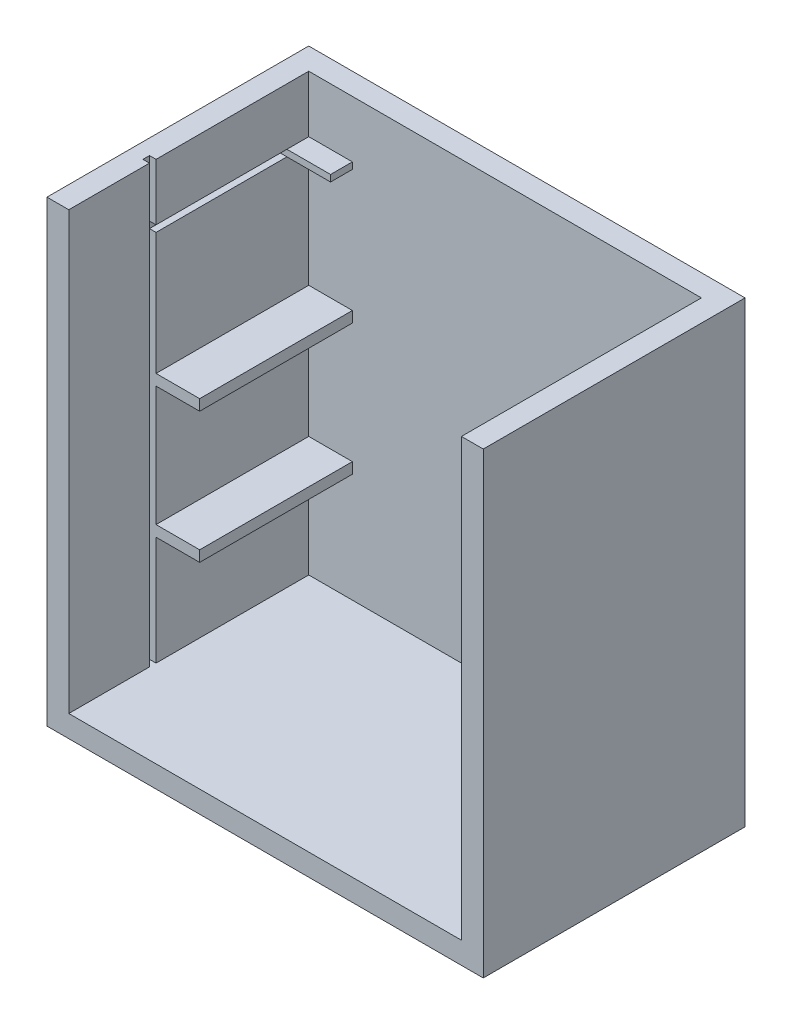
ISO-10303-21;
HEADER;
FILE_DESCRIPTION(('STEP AP214'),'2;1');
FILE_NAME('part.step','',(''),(''),'','','');
FILE_SCHEMA(('AUTOMOTIVE_DESIGN { 1 0 10303 214 1 1 1 1 }'));
ENDSEC;
DATA;
#1=APPLICATION_CONTEXT('core data for automotive mechanical design processes');
#2=APPLICATION_PROTOCOL_DEFINITION('international standard','automotive_design',2000,#1);
#3=PRODUCT_CONTEXT('',#1,'mechanical');
#4=PRODUCT('Part','Part','',(#3));
#5=PRODUCT_RELATED_PRODUCT_CATEGORY('part','',(#4));
#6=PRODUCT_DEFINITION_FORMATION('','',#4);
#7=PRODUCT_DEFINITION_CONTEXT('part definition',#1,'design');
#8=PRODUCT_DEFINITION('design','',#6,#7);
#9=PRODUCT_DEFINITION_SHAPE('','',#8);
#10=(LENGTH_UNIT() NAMED_UNIT(*) SI_UNIT(.MILLI.,.METRE.));
#11=(NAMED_UNIT(*) PLANE_ANGLE_UNIT() SI_UNIT($,.RADIAN.));
#12=(NAMED_UNIT(*) SI_UNIT($,.STERADIAN.) SOLID_ANGLE_UNIT());
#13=UNCERTAINTY_MEASURE_WITH_UNIT(LENGTH_MEASURE(1.E-05),#10,'distance_accuracy_value','');
#14=(GEOMETRIC_REPRESENTATION_CONTEXT(3) GLOBAL_UNCERTAINTY_ASSIGNED_CONTEXT((#13)) GLOBAL_UNIT_ASSIGNED_CONTEXT((#10,
#11,#12)) REPRESENTATION_CONTEXT('',''));
#15=CARTESIAN_POINT('',(0.,0.,0.));
#16=DIRECTION('',(0.,0.,1.));
#17=DIRECTION('',(1.,0.,0.));
#18=AXIS2_PLACEMENT_3D('',#15,#16,#17);
#19=CARTESIAN_POINT('',(30.,1.11022302462517E-13,-40.0000000000005));
#20=DIRECTION('',(0.,0.,1.));
#21=DIRECTION('',(0.,-1.,0.));
#22=AXIS2_PLACEMENT_3D('',#19,#20,#21);
#23=PLANE('',#22);
#24=DIRECTION('',(-1.,0.,0.));
#25=VECTOR('',#24,1.);
#26=CARTESIAN_POINT('',(0.,184.,-40.0000000000005));
#27=LINE('',#26,#25);
#28=CARTESIAN_POINT('',(10.,184.,-40.0000000000005));
#29=VERTEX_POINT('',#28);
#30=CARTESIAN_POINT('',(7.,184.,-40.));
#31=VERTEX_POINT('',#30);
#32=EDGE_CURVE('E396',#29,#31,#27,.T.);
#33=ORIENTED_EDGE('',*,*,#32,.F.);
#34=DIRECTION('',(0.,1.,0.));
#35=VECTOR('',#34,1.);
#36=CARTESIAN_POINT('',(10.,185.,-40.));
#37=LINE('',#36,#35);
#38=CARTESIAN_POINT('',(10.,210.,-40.));
#39=VERTEX_POINT('',#38);
#40=EDGE_CURVE('E354',#29,#39,#37,.T.);
#41=ORIENTED_EDGE('',*,*,#40,.T.);
#42=DIRECTION('',(1.,0.,0.));
#43=VECTOR('',#42,1.);
#44=CARTESIAN_POINT('',(7.,210.,-40.));
#45=LINE('',#44,#43);
#46=CARTESIAN_POINT('',(7.,210.,-40.));
#47=VERTEX_POINT('',#46);
#48=EDGE_CURVE('E372',#47,#39,#45,.T.);
#49=ORIENTED_EDGE('',*,*,#48,.F.);
#50=DIRECTION('',(0.,1.,0.));
#51=VECTOR('',#50,1.);
#52=CARTESIAN_POINT('',(7.,10.,-40.));
#53=LINE('',#52,#51);
#54=EDGE_CURVE('E360',#31,#47,#53,.T.);
#55=ORIENTED_EDGE('',*,*,#54,.F.);
#56=EDGE_LOOP('',(#33,#41,#49,#55));
#57=FACE_BOUND('',#56,.T.);
#58=ADVANCED_FACE('F41',(#57),#23,.T.);
#59=CARTESIAN_POINT('',(10.,210.,0.));
#60=DIRECTION('',(-1.,0.,0.));
#61=DIRECTION('',(0.,0.,1.));
#62=AXIS2_PLACEMENT_3D('',#59,#60,#61);
#63=PLANE('',#62);
#64=DIRECTION('',(0.,0.,-1.));
#65=VECTOR('',#64,1.);
#66=CARTESIAN_POINT('',(10.,10.,0.));
#67=LINE('',#66,#65);
#68=CARTESIAN_POINT('',(10.,10.,0.));
#69=VERTEX_POINT('',#68);
#70=CARTESIAN_POINT('',(10.,10.,-37.));
#71=VERTEX_POINT('',#70);
#72=EDGE_CURVE('E625',#69,#71,#67,.T.);
#73=ORIENTED_EDGE('',*,*,#72,.T.);
#74=DIRECTION('',(0.,-1.,0.));
#75=VECTOR('',#74,1.);
#76=CARTESIAN_POINT('',(10.,210.,-37.));
#77=LINE('',#76,#75);
#78=CARTESIAN_POINT('',(10.,210.,-37.));
#79=VERTEX_POINT('',#78);
#80=EDGE_CURVE('E376',#79,#71,#77,.T.);
#81=ORIENTED_EDGE('',*,*,#80,.F.);
#82=DIRECTION('',(0.,0.,-1.));
#83=VECTOR('',#82,1.);
#84=CARTESIAN_POINT('',(10.,210.,0.));
#85=LINE('',#84,#83);
#86=CARTESIAN_POINT('',(10.,210.,0.));
#87=VERTEX_POINT('',#86);
#88=EDGE_CURVE('E596',#87,#79,#85,.T.);
#89=ORIENTED_EDGE('',*,*,#88,.F.);
#90=DIRECTION('',(0.,-1.,0.));
#91=VECTOR('',#90,1.);
#92=CARTESIAN_POINT('',(10.,210.,0.));
#93=LINE('',#92,#91);
#94=EDGE_CURVE('E649',#87,#69,#93,.T.);
#95=ORIENTED_EDGE('',*,*,#94,.T.);
#96=EDGE_LOOP('',(#73,#81,#89,#95));
#97=FACE_BOUND('',#96,.T.);
#98=ADVANCED_FACE('F702',(#97),#63,.F.);
#99=CARTESIAN_POINT('',(10.,210.,-110.));
#100=VERTEX_POINT('',#99);
#101=EDGE_CURVE('E594',#39,#100,#85,.T.);
#102=ORIENTED_EDGE('',*,*,#101,.F.);
#103=ORIENTED_EDGE('',*,*,#40,.F.);
#104=DIRECTION('',(0.,0.,1.));
#105=VECTOR('',#104,1.);
#106=CARTESIAN_POINT('',(10.,184.,-110.));
#107=LINE('',#106,#105);
#108=CARTESIAN_POINT('',(10.,184.,-100.));
#109=VERTEX_POINT('',#108);
#110=EDGE_CURVE('E339',#109,#29,#107,.T.);
#111=ORIENTED_EDGE('',*,*,#110,.F.);
#112=CARTESIAN_POINT('',(10.,184.,-110.));
#113=VERTEX_POINT('',#112);
#114=EDGE_CURVE('E302',#113,#109,#107,.T.);
#115=ORIENTED_EDGE('',*,*,#114,.F.);
#116=DIRECTION('',(0.,-1.,0.));
#117=VECTOR('',#116,1.);
#118=CARTESIAN_POINT('',(10.,210.,-110.));
#119=LINE('',#118,#117);
#120=EDGE_CURVE('E646',#100,#113,#119,.T.);
#121=ORIENTED_EDGE('',*,*,#120,.F.);
#122=EDGE_LOOP('',(#102,#103,#111,#115,#121));
#123=FACE_BOUND('',#122,.T.);
#124=ADVANCED_FACE('F720',(#123),#63,.F.);
#125=CARTESIAN_POINT('',(10.,181.,-110.));
#126=VERTEX_POINT('',#125);
#127=CARTESIAN_POINT('',(10.,125.,-110.));
#128=VERTEX_POINT('',#127);
#129=EDGE_CURVE('E650',#126,#128,#119,.T.);
#130=ORIENTED_EDGE('',*,*,#129,.F.);
#131=DIRECTION('',(0.,0.,1.));
#132=VECTOR('',#131,1.);
#133=CARTESIAN_POINT('',(10.,181.,-110.));
#134=LINE('',#133,#132);
#135=CARTESIAN_POINT('',(10.,181.,-100.));
#136=VERTEX_POINT('',#135);
#137=EDGE_CURVE('E340',#126,#136,#134,.T.);
#138=ORIENTED_EDGE('',*,*,#137,.T.);
#139=CARTESIAN_POINT('',(10.,181.,-40.0000000000005));
#140=VERTEX_POINT('',#139);
#141=EDGE_CURVE('E65',#136,#140,#134,.T.);
#142=ORIENTED_EDGE('',*,*,#141,.T.);
#143=CARTESIAN_POINT('',(10.,125.,-40.));
#144=VERTEX_POINT('',#143);
#145=EDGE_CURVE('E725',#144,#140,#37,.T.);
#146=ORIENTED_EDGE('',*,*,#145,.F.);
#147=DIRECTION('',(0.,0.,-1.));
#148=VECTOR('',#147,1.);
#149=CARTESIAN_POINT('',(10.,125.,0.));
#150=LINE('',#149,#148);
#151=EDGE_CURVE('E549',#144,#128,#150,.T.);
#152=ORIENTED_EDGE('',*,*,#151,.T.);
#153=EDGE_LOOP('',(#130,#138,#142,#146,#152));
#154=FACE_BOUND('',#153,.T.);
#155=ADVANCED_FACE('F731',(#154),#63,.F.);
#156=DIRECTION('',(0.,0.,1.));
#157=VECTOR('',#156,1.);
#158=CARTESIAN_POINT('',(10.,120.,0.));
#159=LINE('',#158,#157);
#160=CARTESIAN_POINT('',(10.,120.,-110.));
#161=VERTEX_POINT('',#160);
#162=CARTESIAN_POINT('',(10.,120.,-40.));
#163=VERTEX_POINT('',#162);
#164=EDGE_CURVE('E555',#161,#163,#159,.T.);
#165=ORIENTED_EDGE('',*,*,#164,.T.);
#166=CARTESIAN_POINT('',(10.,65.,-40.));
#167=VERTEX_POINT('',#166);
#168=EDGE_CURVE('E377',#167,#163,#37,.T.);
#169=ORIENTED_EDGE('',*,*,#168,.F.);
#170=DIRECTION('',(0.,0.,-1.));
#171=VECTOR('',#170,1.);
#172=CARTESIAN_POINT('',(10.,65.,0.));
#173=LINE('',#172,#171);
#174=CARTESIAN_POINT('',(10.,65.,-110.));
#175=VERTEX_POINT('',#174);
#176=EDGE_CURVE('E511',#167,#175,#173,.T.);
#177=ORIENTED_EDGE('',*,*,#176,.T.);
#178=EDGE_CURVE('E757',#161,#175,#119,.T.);
#179=ORIENTED_EDGE('',*,*,#178,.F.);
#180=EDGE_LOOP('',(#165,#169,#177,#179));
#181=FACE_BOUND('',#180,.T.);
#182=ADVANCED_FACE('F776',(#181),#63,.F.);
#183=CARTESIAN_POINT('',(0.,210.,-110.));
#184=DIRECTION('',(0.,0.,1.));
#185=DIRECTION('',(1.,0.,0.));
#186=AXIS2_PLACEMENT_3D('',#183,#184,#185);
#187=PLANE('',#186);
#188=DIRECTION('',(-1.,0.,0.));
#189=VECTOR('',#188,1.);
#190=CARTESIAN_POINT('',(30.,181.,-110.));
#191=LINE('',#190,#189);
#192=CARTESIAN_POINT('',(30.,181.,-110.));
#193=VERTEX_POINT('',#192);
#194=EDGE_CURVE('E334',#193,#126,#191,.T.);
#195=ORIENTED_EDGE('',*,*,#194,.T.);
#196=ORIENTED_EDGE('',*,*,#129,.T.);
#197=DIRECTION('',(-1.,0.,0.));
#198=VECTOR('',#197,1.);
#199=CARTESIAN_POINT('',(30.,125.,-110.));
#200=LINE('',#199,#198);
#201=CARTESIAN_POINT('',(30.,125.,-110.));
#202=VERTEX_POINT('',#201);
#203=EDGE_CURVE('E567',#202,#128,#200,.T.);
#204=ORIENTED_EDGE('',*,*,#203,.F.);
#205=DIRECTION('',(0.,1.,0.));
#206=VECTOR('',#205,1.);
#207=CARTESIAN_POINT('',(30.,0.,-110.));
#208=LINE('',#207,#206);
#209=CARTESIAN_POINT('',(30.,120.,-110.));
#210=VERTEX_POINT('',#209);
#211=EDGE_CURVE('E563',#210,#202,#208,.T.);
#212=ORIENTED_EDGE('',*,*,#211,.F.);
#213=DIRECTION('',(-1.,0.,0.));
#214=VECTOR('',#213,1.);
#215=CARTESIAN_POINT('',(30.,120.,-110.));
#216=LINE('',#215,#214);
#217=EDGE_CURVE('E576',#210,#161,#216,.T.);
#218=ORIENTED_EDGE('',*,*,#217,.T.);
#219=ORIENTED_EDGE('',*,*,#178,.T.);
#220=DIRECTION('',(-1.,0.,0.));
#221=VECTOR('',#220,1.);
#222=CARTESIAN_POINT('',(30.,65.,-110.));
#223=LINE('',#222,#221);
#224=CARTESIAN_POINT('',(30.,65.,-110.));
#225=VERTEX_POINT('',#224);
#226=EDGE_CURVE('E529',#225,#175,#223,.T.);
#227=ORIENTED_EDGE('',*,*,#226,.F.);
#228=DIRECTION('',(0.,1.,0.));
#229=VECTOR('',#228,1.);
#230=CARTESIAN_POINT('',(30.,0.,-110.));
#231=LINE('',#230,#229);
#232=CARTESIAN_POINT('',(30.,60.,-110.));
#233=VERTEX_POINT('',#232);
#234=EDGE_CURVE('E525',#233,#225,#231,.T.);
#235=ORIENTED_EDGE('',*,*,#234,.F.);
#236=DIRECTION('',(-1.,0.,0.));
#237=VECTOR('',#236,1.);
#238=CARTESIAN_POINT('',(30.,60.,-110.));
#239=LINE('',#238,#237);
#240=CARTESIAN_POINT('',(10.,60.,-110.));
#241=VERTEX_POINT('',#240);
#242=EDGE_CURVE('E538',#233,#241,#239,.T.);
#243=ORIENTED_EDGE('',*,*,#242,.T.);
#244=CARTESIAN_POINT('',(10.,10.,-110.));
#245=VERTEX_POINT('',#244);
#246=EDGE_CURVE('E644',#241,#245,#119,.T.);
#247=ORIENTED_EDGE('',*,*,#246,.T.);
#248=DIRECTION('',(-1.,0.,0.));
#249=VECTOR('',#248,1.);
#250=CARTESIAN_POINT('',(0.,10.,-110.));
#251=LINE('',#250,#249);
#252=CARTESIAN_POINT('',(190.,10.,-110.));
#253=VERTEX_POINT('',#252);
#254=EDGE_CURVE('E629',#253,#245,#251,.T.);
#255=ORIENTED_EDGE('',*,*,#254,.F.);
#256=DIRECTION('',(0.,-1.,0.));
#257=VECTOR('',#256,1.);
#258=CARTESIAN_POINT('',(190.,210.,-110.));
#259=LINE('',#258,#257);
#260=CARTESIAN_POINT('',(190.,60.,-110.));
#261=VERTEX_POINT('',#260);
#262=EDGE_CURVE('E639',#261,#253,#259,.T.);
#263=ORIENTED_EDGE('',*,*,#262,.F.);
#264=DIRECTION('',(1.,0.,0.));
#265=VECTOR('',#264,1.);
#266=CARTESIAN_POINT('',(170.,60.,-110.));
#267=LINE('',#266,#265);
#268=CARTESIAN_POINT('',(170.,60.,-110.));
#269=VERTEX_POINT('',#268);
#270=EDGE_CURVE('E427',#269,#261,#267,.T.);
#271=ORIENTED_EDGE('',*,*,#270,.F.);
#272=DIRECTION('',(0.,-1.,0.));
#273=VECTOR('',#272,1.);
#274=CARTESIAN_POINT('',(170.,0.,-110.));
#275=LINE('',#274,#273);
#276=CARTESIAN_POINT('',(170.,65.,-110.));
#277=VERTEX_POINT('',#276);
#278=EDGE_CURVE('E409',#277,#269,#275,.T.);
#279=ORIENTED_EDGE('',*,*,#278,.F.);
#280=DIRECTION('',(1.,0.,0.));
#281=VECTOR('',#280,1.);
#282=CARTESIAN_POINT('',(170.,65.,-110.));
#283=LINE('',#282,#281);
#284=CARTESIAN_POINT('',(190.,65.,-110.));
#285=VERTEX_POINT('',#284);
#286=EDGE_CURVE('E430',#277,#285,#283,.T.);
#287=ORIENTED_EDGE('',*,*,#286,.T.);
#288=CARTESIAN_POINT('',(190.,120.,-110.));
#289=VERTEX_POINT('',#288);
#290=EDGE_CURVE('E1270',#289,#285,#259,.T.);
#291=ORIENTED_EDGE('',*,*,#290,.F.);
#292=DIRECTION('',(1.,0.,0.));
#293=VECTOR('',#292,1.);
#294=CARTESIAN_POINT('',(170.,120.,-110.));
#295=LINE('',#294,#293);
#296=CARTESIAN_POINT('',(170.,120.,-110.));
#297=VERTEX_POINT('',#296);
#298=EDGE_CURVE('E464',#297,#289,#295,.T.);
#299=ORIENTED_EDGE('',*,*,#298,.F.);
#300=DIRECTION('',(0.,-1.,0.));
#301=VECTOR('',#300,1.);
#302=CARTESIAN_POINT('',(170.,0.,-110.));
#303=LINE('',#302,#301);
#304=CARTESIAN_POINT('',(170.,125.,-110.));
#305=VERTEX_POINT('',#304);
#306=EDGE_CURVE('E446',#305,#297,#303,.T.);
#307=ORIENTED_EDGE('',*,*,#306,.F.);
#308=DIRECTION('',(1.,0.,0.));
#309=VECTOR('',#308,1.);
#310=CARTESIAN_POINT('',(170.,125.,-110.));
#311=LINE('',#310,#309);
#312=CARTESIAN_POINT('',(190.,125.,-110.));
#313=VERTEX_POINT('',#312);
#314=EDGE_CURVE('E467',#305,#313,#311,.T.);
#315=ORIENTED_EDGE('',*,*,#314,.T.);
#316=CARTESIAN_POINT('',(190.,180.,-110.));
#317=VERTEX_POINT('',#316);
#318=EDGE_CURVE('E645',#317,#313,#259,.T.);
#319=ORIENTED_EDGE('',*,*,#318,.F.);
#320=DIRECTION('',(1.,0.,0.));
#321=VECTOR('',#320,1.);
#322=CARTESIAN_POINT('',(170.,180.,-110.));
#323=LINE('',#322,#321);
#324=CARTESIAN_POINT('',(170.,180.,-110.));
#325=VERTEX_POINT('',#324);
#326=EDGE_CURVE('E501',#325,#317,#323,.T.);
#327=ORIENTED_EDGE('',*,*,#326,.F.);
#328=DIRECTION('',(0.,-1.,0.));
#329=VECTOR('',#328,1.);
#330=CARTESIAN_POINT('',(170.,0.,-110.));
#331=LINE('',#330,#329);
#332=CARTESIAN_POINT('',(170.,185.,-110.));
#333=VERTEX_POINT('',#332);
#334=EDGE_CURVE('E483',#333,#325,#331,.T.);
#335=ORIENTED_EDGE('',*,*,#334,.F.);
#336=DIRECTION('',(1.,0.,0.));
#337=VECTOR('',#336,1.);
#338=CARTESIAN_POINT('',(170.,185.,-110.));
#339=LINE('',#338,#337);
#340=CARTESIAN_POINT('',(190.,185.,-110.));
#341=VERTEX_POINT('',#340);
#342=EDGE_CURVE('E504',#333,#341,#339,.T.);
#343=ORIENTED_EDGE('',*,*,#342,.T.);
#344=CARTESIAN_POINT('',(190.,210.,-110.));
#345=VERTEX_POINT('',#344);
#346=EDGE_CURVE('E640',#345,#341,#259,.T.);
#347=ORIENTED_EDGE('',*,*,#346,.F.);
#348=DIRECTION('',(-1.,0.,0.));
#349=VECTOR('',#348,1.);
#350=CARTESIAN_POINT('',(0.,210.,-110.));
#351=LINE('',#350,#349);
#352=EDGE_CURVE('E600',#345,#100,#351,.T.);
#353=ORIENTED_EDGE('',*,*,#352,.T.);
#354=ORIENTED_EDGE('',*,*,#120,.T.);
#355=DIRECTION('',(1.,0.,0.));
#356=VECTOR('',#355,1.);
#357=CARTESIAN_POINT('',(10.,184.,-110.));
#358=LINE('',#357,#356);
#359=CARTESIAN_POINT('',(30.,184.,-110.));
#360=VERTEX_POINT('',#359);
#361=EDGE_CURVE('E336',#113,#360,#358,.T.);
#362=ORIENTED_EDGE('',*,*,#361,.T.);
#363=DIRECTION('',(0.,1.,0.));
#364=VECTOR('',#363,1.);
#365=CARTESIAN_POINT('',(30.,0.,-110.));
#366=LINE('',#365,#364);
#367=EDGE_CURVE('E313',#193,#360,#366,.T.);
#368=ORIENTED_EDGE('',*,*,#367,.F.);
#369=EDGE_LOOP('',(#195,#196,#204,#212,#218,#219,#227,#235,#243,#247,#255,#263,#271,#279,#287,
#291,#299,#307,#315,#319,#327,#335,#343,#347,#353,#354,#362,#368));
#370=FACE_BOUND('',#369,.T.);
#371=ADVANCED_FACE('F753',(#370),#187,.T.);
#372=CARTESIAN_POINT('',(190.,210.,0.));
#373=DIRECTION('',(-1.,0.,0.));
#374=DIRECTION('',(0.,0.,1.));
#375=AXIS2_PLACEMENT_3D('',#372,#373,#374);
#376=PLANE('',#375);
#377=ORIENTED_EDGE('',*,*,#290,.T.);
#378=DIRECTION('',(0.,0.,-1.));
#379=VECTOR('',#378,1.);
#380=CARTESIAN_POINT('',(190.,65.,0.));
#381=LINE('',#380,#379);
#382=CARTESIAN_POINT('',(190.,65.,-40.));
#383=VERTEX_POINT('',#382);
#384=EDGE_CURVE('E419',#383,#285,#381,.T.);
#385=ORIENTED_EDGE('',*,*,#384,.F.);
#386=DIRECTION('',(0.,1.,0.));
#387=VECTOR('',#386,1.);
#388=CARTESIAN_POINT('',(190.,0.,-40.));
#389=LINE('',#388,#387);
#390=CARTESIAN_POINT('',(190.,60.,-40.));
#391=VERTEX_POINT('',#390);
#392=EDGE_CURVE('E400',#391,#383,#389,.T.);
#393=ORIENTED_EDGE('',*,*,#392,.F.);
#394=DIRECTION('',(0.,0.,1.));
#395=VECTOR('',#394,1.);
#396=CARTESIAN_POINT('',(190.,60.,0.));
#397=LINE('',#396,#395);
#398=EDGE_CURVE('E406',#261,#391,#397,.T.);
#399=ORIENTED_EDGE('',*,*,#398,.F.);
#400=ORIENTED_EDGE('',*,*,#262,.T.);
#401=DIRECTION('',(0.,0.,-1.));
#402=VECTOR('',#401,1.);
#403=CARTESIAN_POINT('',(190.,10.,0.));
#404=LINE('',#403,#402);
#405=CARTESIAN_POINT('',(190.,10.,0.));
#406=VERTEX_POINT('',#405);
#407=EDGE_CURVE('E595',#406,#253,#404,.T.);
#408=ORIENTED_EDGE('',*,*,#407,.F.);
#409=DIRECTION('',(0.,-1.,0.));
#410=VECTOR('',#409,1.);
#411=CARTESIAN_POINT('',(190.,210.,0.));
#412=LINE('',#411,#410);
#413=CARTESIAN_POINT('',(190.,210.,0.));
#414=VERTEX_POINT('',#413);
#415=EDGE_CURVE('E624',#414,#406,#412,.T.);
#416=ORIENTED_EDGE('',*,*,#415,.F.);
#417=DIRECTION('',(0.,0.,-1.));
#418=VECTOR('',#417,1.);
#419=CARTESIAN_POINT('',(190.,210.,0.));
#420=LINE('',#419,#418);
#421=EDGE_CURVE('E604',#414,#345,#420,.T.);
#422=ORIENTED_EDGE('',*,*,#421,.T.);
#423=ORIENTED_EDGE('',*,*,#346,.T.);
#424=DIRECTION('',(0.,0.,-1.));
#425=VECTOR('',#424,1.);
#426=CARTESIAN_POINT('',(190.,185.,0.));
#427=LINE('',#426,#425);
#428=CARTESIAN_POINT('',(190.,185.,-40.));
#429=VERTEX_POINT('',#428);
#430=EDGE_CURVE('E493',#429,#341,#427,.T.);
#431=ORIENTED_EDGE('',*,*,#430,.F.);
#432=DIRECTION('',(0.,1.,0.));
#433=VECTOR('',#432,1.);
#434=CARTESIAN_POINT('',(190.,0.,-40.));
#435=LINE('',#434,#433);
#436=CARTESIAN_POINT('',(190.,180.,-40.));
#437=VERTEX_POINT('',#436);
#438=EDGE_CURVE('E474',#437,#429,#435,.T.);
#439=ORIENTED_EDGE('',*,*,#438,.F.);
#440=DIRECTION('',(0.,0.,1.));
#441=VECTOR('',#440,1.);
#442=CARTESIAN_POINT('',(190.,180.,0.));
#443=LINE('',#442,#441);
#444=EDGE_CURVE('E480',#317,#437,#443,.T.);
#445=ORIENTED_EDGE('',*,*,#444,.F.);
#446=ORIENTED_EDGE('',*,*,#318,.T.);
#447=DIRECTION('',(0.,0.,-1.));
#448=VECTOR('',#447,1.);
#449=CARTESIAN_POINT('',(190.,125.,0.));
#450=LINE('',#449,#448);
#451=CARTESIAN_POINT('',(190.,125.,-40.));
#452=VERTEX_POINT('',#451);
#453=EDGE_CURVE('E456',#452,#313,#450,.T.);
#454=ORIENTED_EDGE('',*,*,#453,.F.);
#455=DIRECTION('',(0.,1.,0.));
#456=VECTOR('',#455,1.);
#457=CARTESIAN_POINT('',(190.,0.,-40.0000000000001));
#458=LINE('',#457,#456);
#459=CARTESIAN_POINT('',(190.,120.,-40.));
#460=VERTEX_POINT('',#459);
#461=EDGE_CURVE('E437',#460,#452,#458,.T.);
#462=ORIENTED_EDGE('',*,*,#461,.F.);
#463=DIRECTION('',(0.,0.,1.));
#464=VECTOR('',#463,1.);
#465=CARTESIAN_POINT('',(190.,120.,0.));
#466=LINE('',#465,#464);
#467=EDGE_CURVE('E443',#289,#460,#466,.T.);
#468=ORIENTED_EDGE('',*,*,#467,.F.);
#469=EDGE_LOOP('',(#377,#385,#393,#399,#400,#408,#416,#422,#423,#431,#439,#445,#446,#454,#462,#468));
#470=FACE_BOUND('',#469,.T.);
#471=ADVANCED_FACE('F817',(#470),#376,.T.);
#472=CARTESIAN_POINT('',(0.,10.,0.));
#473=DIRECTION('',(0.,1.,0.));
#474=DIRECTION('',(0.,0.,1.));
#475=AXIS2_PLACEMENT_3D('',#472,#473,#474);
#476=PLANE('',#475);
#477=DIRECTION('',(1.,0.,0.));
#478=VECTOR('',#477,1.);
#479=CARTESIAN_POINT('',(0.,10.,0.));
#480=LINE('',#479,#478);
#481=EDGE_CURVE('E655',#69,#406,#480,.T.);
#482=ORIENTED_EDGE('',*,*,#481,.T.);
#483=ORIENTED_EDGE('',*,*,#407,.T.);
#484=ORIENTED_EDGE('',*,*,#254,.T.);
#485=CARTESIAN_POINT('',(10.,10.,-40.));
#486=VERTEX_POINT('',#485);
#487=EDGE_CURVE('E589',#486,#245,#67,.T.);
#488=ORIENTED_EDGE('',*,*,#487,.F.);
#489=DIRECTION('',(1.,0.,0.));
#490=VECTOR('',#489,1.);
#491=CARTESIAN_POINT('',(7.,10.,-40.));
#492=LINE('',#491,#490);
#493=CARTESIAN_POINT('',(7.,10.,-40.));
#494=VERTEX_POINT('',#493);
#495=EDGE_CURVE('E381',#494,#486,#492,.T.);
#496=ORIENTED_EDGE('',*,*,#495,.F.);
#497=DIRECTION('',(0.,0.,-1.));
#498=VECTOR('',#497,1.);
#499=CARTESIAN_POINT('',(7.,10.,-37.));
#500=LINE('',#499,#498);
#501=CARTESIAN_POINT('',(7.,10.,-37.));
#502=VERTEX_POINT('',#501);
#503=EDGE_CURVE('E368',#502,#494,#500,.T.);
#504=ORIENTED_EDGE('',*,*,#503,.F.);
#505=DIRECTION('',(1.,0.,0.));
#506=VECTOR('',#505,1.);
#507=CARTESIAN_POINT('',(7.,10.,-37.));
#508=LINE('',#507,#506);
#509=EDGE_CURVE('E385',#502,#71,#508,.T.);
#510=ORIENTED_EDGE('',*,*,#509,.T.);
#511=ORIENTED_EDGE('',*,*,#72,.F.);
#512=EDGE_LOOP('',(#482,#483,#484,#488,#496,#504,#510,#511));
#513=FACE_BOUND('',#512,.T.);
#514=ADVANCED_FACE('F748',(#513),#476,.T.);
#515=CARTESIAN_POINT('',(0.,10.,-120.));
#516=DIRECTION('',(1.,0.,0.));
#517=DIRECTION('',(0.,0.,-1.));
#518=AXIS2_PLACEMENT_3D('',#515,#516,#517);
#519=PLANE('',#518);
#520=DIRECTION('',(0.,0.,1.));
#521=VECTOR('',#520,1.);
#522=CARTESIAN_POINT('',(0.,0.,-120.));
#523=LINE('',#522,#521);
#524=CARTESIAN_POINT('',(0.,0.,-120.));
#525=VERTEX_POINT('',#524);
#526=CARTESIAN_POINT('',(0.,0.,0.));
#527=VERTEX_POINT('',#526);
#528=EDGE_CURVE('E654',#525,#527,#523,.T.);
#529=ORIENTED_EDGE('',*,*,#528,.T.);
#530=DIRECTION('',(0.,-1.,0.));
#531=VECTOR('',#530,1.);
#532=CARTESIAN_POINT('',(0.,10.,0.));
#533=LINE('',#532,#531);
#534=CARTESIAN_POINT('',(0.,210.,0.));
#535=VERTEX_POINT('',#534);
#536=EDGE_CURVE('E11',#535,#527,#533,.T.);
#537=ORIENTED_EDGE('',*,*,#536,.F.);
#538=DIRECTION('',(0.,0.,1.));
#539=VECTOR('',#538,1.);
#540=CARTESIAN_POINT('',(0.,210.,0.));
#541=LINE('',#540,#539);
#542=CARTESIAN_POINT('',(0.,210.,-120.));
#543=VERTEX_POINT('',#542);
#544=EDGE_CURVE('E620',#543,#535,#541,.T.);
#545=ORIENTED_EDGE('',*,*,#544,.F.);
#546=DIRECTION('',(0.,-1.,0.));
#547=VECTOR('',#546,1.);
#548=CARTESIAN_POINT('',(0.,10.,-120.));
#549=LINE('',#548,#547);
#550=EDGE_CURVE('E658',#543,#525,#549,.T.);
#551=ORIENTED_EDGE('',*,*,#550,.T.);
#552=EDGE_LOOP('',(#529,#537,#545,#551));
#553=FACE_BOUND('',#552,.T.);
#554=ADVANCED_FACE('F43',(#553),#519,.F.);
#555=CARTESIAN_POINT('',(0.,10.,0.));
#556=DIRECTION('',(0.,0.,-1.));
#557=DIRECTION('',(-1.,0.,0.));
#558=AXIS2_PLACEMENT_3D('',#555,#556,#557);
#559=PLANE('',#558);
#560=DIRECTION('',(1.,0.,0.));
#561=VECTOR('',#560,1.);
#562=CARTESIAN_POINT('',(0.,0.,0.));
#563=LINE('',#562,#561);
#564=CARTESIAN_POINT('',(200.,0.,0.));
#565=VERTEX_POINT('',#564);
#566=EDGE_CURVE('E663',#527,#565,#563,.T.);
#567=ORIENTED_EDGE('',*,*,#566,.T.);
#568=DIRECTION('',(0.,-1.,0.));
#569=VECTOR('',#568,1.);
#570=CARTESIAN_POINT('',(200.,10.,0.));
#571=LINE('',#570,#569);
#572=CARTESIAN_POINT('',(200.,210.,0.));
#573=VERTEX_POINT('',#572);
#574=EDGE_CURVE('E50',#573,#565,#571,.T.);
#575=ORIENTED_EDGE('',*,*,#574,.F.);
#576=DIRECTION('',(1.,0.,0.));
#577=VECTOR('',#576,1.);
#578=CARTESIAN_POINT('',(0.,210.,0.));
#579=LINE('',#578,#577);
#580=EDGE_CURVE('E608',#414,#573,#579,.T.);
#581=ORIENTED_EDGE('',*,*,#580,.F.);
#582=ORIENTED_EDGE('',*,*,#415,.T.);
#583=ORIENTED_EDGE('',*,*,#481,.F.);
#584=ORIENTED_EDGE('',*,*,#94,.F.);
#585=DIRECTION('',(1.,0.,0.));
#586=VECTOR('',#585,1.);
#587=CARTESIAN_POINT('',(0.,210.,0.));
#588=LINE('',#587,#586);
#589=EDGE_CURVE('E590',#535,#87,#588,.T.);
#590=ORIENTED_EDGE('',*,*,#589,.F.);
#591=ORIENTED_EDGE('',*,*,#536,.T.);
#592=EDGE_LOOP('',(#567,#575,#581,#582,#583,#584,#590,#591));
#593=FACE_BOUND('',#592,.T.);
#594=ADVANCED_FACE('F699',(#593),#559,.F.);
#595=CARTESIAN_POINT('',(200.,10.,0.));
#596=DIRECTION('',(-1.,0.,0.));
#597=DIRECTION('',(0.,0.,1.));
#598=AXIS2_PLACEMENT_3D('',#595,#596,#597);
#599=PLANE('',#598);
#600=DIRECTION('',(0.,0.,-1.));
#601=VECTOR('',#600,1.);
#602=CARTESIAN_POINT('',(200.,0.,0.));
#603=LINE('',#602,#601);
#604=CARTESIAN_POINT('',(200.,0.,-120.));
#605=VERTEX_POINT('',#604);
#606=EDGE_CURVE('E666',#565,#605,#603,.T.);
#607=ORIENTED_EDGE('',*,*,#606,.T.);
#608=DIRECTION('',(0.,-1.,0.));
#609=VECTOR('',#608,1.);
#610=CARTESIAN_POINT('',(200.,10.,-120.));
#611=LINE('',#610,#609);
#612=CARTESIAN_POINT('',(200.,210.,-120.));
#613=VERTEX_POINT('',#612);
#614=EDGE_CURVE('E674',#613,#605,#611,.T.);
#615=ORIENTED_EDGE('',*,*,#614,.F.);
#616=DIRECTION('',(0.,0.,-1.));
#617=VECTOR('',#616,1.);
#618=CARTESIAN_POINT('',(200.,210.,0.));
#619=LINE('',#618,#617);
#620=EDGE_CURVE('E612',#573,#613,#619,.T.);
#621=ORIENTED_EDGE('',*,*,#620,.F.);
#622=ORIENTED_EDGE('',*,*,#574,.T.);
#623=EDGE_LOOP('',(#607,#615,#621,#622));
#624=FACE_BOUND('',#623,.T.);
#625=ADVANCED_FACE('F682',(#624),#599,.F.);
#626=CARTESIAN_POINT('',(200.,10.,-120.));
#627=DIRECTION('',(0.,0.,1.));
#628=DIRECTION('',(1.,0.,0.));
#629=AXIS2_PLACEMENT_3D('',#626,#627,#628);
#630=PLANE('',#629);
#631=DIRECTION('',(-1.,0.,0.));
#632=VECTOR('',#631,1.);
#633=CARTESIAN_POINT('',(200.,0.,-120.));
#634=LINE('',#633,#632);
#635=EDGE_CURVE('E659',#605,#525,#634,.T.);
#636=ORIENTED_EDGE('',*,*,#635,.T.);
#637=ORIENTED_EDGE('',*,*,#550,.F.);
#638=DIRECTION('',(-1.,0.,0.));
#639=VECTOR('',#638,1.);
#640=CARTESIAN_POINT('',(0.,210.,-120.));
#641=LINE('',#640,#639);
#642=EDGE_CURVE('E616',#613,#543,#641,.T.);
#643=ORIENTED_EDGE('',*,*,#642,.F.);
#644=ORIENTED_EDGE('',*,*,#614,.T.);
#645=EDGE_LOOP('',(#636,#637,#643,#644));
#646=FACE_BOUND('',#645,.T.);
#647=ADVANCED_FACE('F690',(#646),#630,.F.);
#648=CARTESIAN_POINT('',(0.,0.,0.));
#649=DIRECTION('',(0.,1.,0.));
#650=DIRECTION('',(0.,0.,1.));
#651=AXIS2_PLACEMENT_3D('',#648,#649,#650);
#652=PLANE('',#651);
#653=ORIENTED_EDGE('',*,*,#528,.F.);
#654=ORIENTED_EDGE('',*,*,#635,.F.);
#655=ORIENTED_EDGE('',*,*,#606,.F.);
#656=ORIENTED_EDGE('',*,*,#566,.F.);
#657=EDGE_LOOP('',(#653,#654,#655,#656));
#658=FACE_BOUND('',#657,.T.);
#659=ADVANCED_FACE('F688',(#658),#652,.F.);
#660=DIRECTION('',(0.,0.,1.));
#661=VECTOR('',#660,1.);
#662=CARTESIAN_POINT('',(10.,60.,0.));
#663=LINE('',#662,#661);
#664=CARTESIAN_POINT('',(10.,60.,-40.));
#665=VERTEX_POINT('',#664);
#666=EDGE_CURVE('E517',#241,#665,#663,.T.);
#667=ORIENTED_EDGE('',*,*,#666,.T.);
#668=EDGE_CURVE('E373',#486,#665,#37,.T.);
#669=ORIENTED_EDGE('',*,*,#668,.F.);
#670=ORIENTED_EDGE('',*,*,#487,.T.);
#671=ORIENTED_EDGE('',*,*,#246,.F.);
#672=EDGE_LOOP('',(#667,#669,#670,#671));
#673=FACE_BOUND('',#672,.T.);
#674=ADVANCED_FACE('F744',(#673),#63,.F.);
#675=CARTESIAN_POINT('',(0.,210.,0.));
#676=DIRECTION('',(0.,1.,0.));
#677=DIRECTION('',(0.,0.,1.));
#678=AXIS2_PLACEMENT_3D('',#675,#676,#677);
#679=PLANE('',#678);
#680=DIRECTION('',(1.,0.,0.));
#681=VECTOR('',#680,1.);
#682=CARTESIAN_POINT('',(7.,210.,-37.));
#683=LINE('',#682,#681);
#684=CARTESIAN_POINT('',(7.,210.,-37.));
#685=VERTEX_POINT('',#684);
#686=EDGE_CURVE('E388',#685,#79,#683,.T.);
#687=ORIENTED_EDGE('',*,*,#686,.F.);
#688=DIRECTION('',(0.,0.,1.));
#689=VECTOR('',#688,1.);
#690=CARTESIAN_POINT('',(7.,210.,-40.));
#691=LINE('',#690,#689);
#692=EDGE_CURVE('E359',#47,#685,#691,.T.);
#693=ORIENTED_EDGE('',*,*,#692,.F.);
#694=ORIENTED_EDGE('',*,*,#48,.T.);
#695=ORIENTED_EDGE('',*,*,#101,.T.);
#696=ORIENTED_EDGE('',*,*,#352,.F.);
#697=ORIENTED_EDGE('',*,*,#421,.F.);
#698=ORIENTED_EDGE('',*,*,#580,.T.);
#699=ORIENTED_EDGE('',*,*,#620,.T.);
#700=ORIENTED_EDGE('',*,*,#642,.T.);
#701=ORIENTED_EDGE('',*,*,#544,.T.);
#702=ORIENTED_EDGE('',*,*,#589,.T.);
#703=ORIENTED_EDGE('',*,*,#88,.T.);
#704=EDGE_LOOP('',(#687,#693,#694,#695,#696,#697,#698,#699,#700,#701,#702,#703));
#705=FACE_BOUND('',#704,.T.);
#706=ADVANCED_FACE('F697',(#705),#679,.T.);
#707=ORIENTED_EDGE('',*,*,#145,.T.);
#708=DIRECTION('',(1.,0.,0.));
#709=VECTOR('',#708,1.);
#710=CARTESIAN_POINT('',(0.,181.,-40.0000000000005));
#711=LINE('',#710,#709);
#712=CARTESIAN_POINT('',(7.,181.,-40.));
#713=VERTEX_POINT('',#712);
#714=EDGE_CURVE('E384',#713,#140,#711,.T.);
#715=ORIENTED_EDGE('',*,*,#714,.F.);
#716=EDGE_CURVE('E355',#494,#713,#53,.T.);
#717=ORIENTED_EDGE('',*,*,#716,.F.);
#718=ORIENTED_EDGE('',*,*,#495,.T.);
#719=ORIENTED_EDGE('',*,*,#668,.T.);
#720=DIRECTION('',(-1.,0.,0.));
#721=VECTOR('',#720,1.);
#722=CARTESIAN_POINT('',(30.,60.,-40.));
#723=LINE('',#722,#721);
#724=CARTESIAN_POINT('',(30.,60.,-40.));
#725=VERTEX_POINT('',#724);
#726=EDGE_CURVE('E541',#725,#665,#723,.T.);
#727=ORIENTED_EDGE('',*,*,#726,.F.);
#728=DIRECTION('',(0.,1.,0.));
#729=VECTOR('',#728,1.);
#730=CARTESIAN_POINT('',(30.,0.,-40.));
#731=LINE('',#730,#729);
#732=CARTESIAN_POINT('',(30.,65.,-40.));
#733=VERTEX_POINT('',#732);
#734=EDGE_CURVE('E516',#725,#733,#731,.T.);
#735=ORIENTED_EDGE('',*,*,#734,.T.);
#736=DIRECTION('',(-1.,0.,0.));
#737=VECTOR('',#736,1.);
#738=CARTESIAN_POINT('',(30.,65.,-40.));
#739=LINE('',#738,#737);
#740=EDGE_CURVE('E545',#733,#167,#739,.T.);
#741=ORIENTED_EDGE('',*,*,#740,.T.);
#742=ORIENTED_EDGE('',*,*,#168,.T.);
#743=DIRECTION('',(-1.,0.,0.));
#744=VECTOR('',#743,1.);
#745=CARTESIAN_POINT('',(30.,120.,-40.));
#746=LINE('',#745,#744);
#747=CARTESIAN_POINT('',(30.,120.,-40.));
#748=VERTEX_POINT('',#747);
#749=EDGE_CURVE('E579',#748,#163,#746,.T.);
#750=ORIENTED_EDGE('',*,*,#749,.F.);
#751=DIRECTION('',(0.,1.,0.));
#752=VECTOR('',#751,1.);
#753=CARTESIAN_POINT('',(30.,0.,-40.));
#754=LINE('',#753,#752);
#755=CARTESIAN_POINT('',(30.,125.,-40.));
#756=VERTEX_POINT('',#755);
#757=EDGE_CURVE('E554',#748,#756,#754,.T.);
#758=ORIENTED_EDGE('',*,*,#757,.T.);
#759=DIRECTION('',(-1.,0.,0.));
#760=VECTOR('',#759,1.);
#761=CARTESIAN_POINT('',(30.,125.,-40.));
#762=LINE('',#761,#760);
#763=EDGE_CURVE('E583',#756,#144,#762,.T.);
#764=ORIENTED_EDGE('',*,*,#763,.T.);
#765=EDGE_LOOP('',(#707,#715,#717,#718,#719,#727,#735,#741,#742,#750,#758,#764));
#766=FACE_BOUND('',#765,.T.);
#767=ADVANCED_FACE('F734',(#766),#23,.T.);
#768=CARTESIAN_POINT('',(30.,125.,0.));
#769=DIRECTION('',(0.,1.,0.));
#770=DIRECTION('',(0.,0.,1.));
#771=AXIS2_PLACEMENT_3D('',#768,#769,#770);
#772=PLANE('',#771);
#773=ORIENTED_EDGE('',*,*,#151,.F.);
#774=ORIENTED_EDGE('',*,*,#763,.F.);
#775=DIRECTION('',(0.,0.,-1.));
#776=VECTOR('',#775,1.);
#777=CARTESIAN_POINT('',(30.,125.,0.));
#778=LINE('',#777,#776);
#779=EDGE_CURVE('E550',#756,#202,#778,.T.);
#780=ORIENTED_EDGE('',*,*,#779,.T.);
#781=ORIENTED_EDGE('',*,*,#203,.T.);
#782=EDGE_LOOP('',(#773,#774,#780,#781));
#783=FACE_BOUND('',#782,.T.);
#784=ADVANCED_FACE('F765',(#783),#772,.T.);
#785=CARTESIAN_POINT('',(30.,120.,0.));
#786=DIRECTION('',(0.,-1.,0.));
#787=DIRECTION('',(0.,0.,-1.));
#788=AXIS2_PLACEMENT_3D('',#785,#786,#787);
#789=PLANE('',#788);
#790=ORIENTED_EDGE('',*,*,#164,.F.);
#791=ORIENTED_EDGE('',*,*,#217,.F.);
#792=DIRECTION('',(0.,0.,1.));
#793=VECTOR('',#792,1.);
#794=CARTESIAN_POINT('',(30.,120.,0.));
#795=LINE('',#794,#793);
#796=EDGE_CURVE('E559',#210,#748,#795,.T.);
#797=ORIENTED_EDGE('',*,*,#796,.T.);
#798=ORIENTED_EDGE('',*,*,#749,.T.);
#799=EDGE_LOOP('',(#790,#791,#797,#798));
#800=FACE_BOUND('',#799,.T.);
#801=ADVANCED_FACE('F773',(#800),#789,.T.);
#802=CARTESIAN_POINT('',(30.,0.,0.));
#803=DIRECTION('',(1.,0.,0.));
#804=DIRECTION('',(0.,0.,-1.));
#805=AXIS2_PLACEMENT_3D('',#802,#803,#804);
#806=PLANE('',#805);
#807=ORIENTED_EDGE('',*,*,#779,.F.);
#808=ORIENTED_EDGE('',*,*,#757,.F.);
#809=ORIENTED_EDGE('',*,*,#796,.F.);
#810=ORIENTED_EDGE('',*,*,#211,.T.);
#811=EDGE_LOOP('',(#807,#808,#809,#810));
#812=FACE_BOUND('',#811,.T.);
#813=ADVANCED_FACE('F769',(#812),#806,.T.);
#814=CARTESIAN_POINT('',(30.,65.,0.));
#815=DIRECTION('',(0.,1.,0.));
#816=DIRECTION('',(0.,0.,1.));
#817=AXIS2_PLACEMENT_3D('',#814,#815,#816);
#818=PLANE('',#817);
#819=ORIENTED_EDGE('',*,*,#176,.F.);
#820=ORIENTED_EDGE('',*,*,#740,.F.);
#821=DIRECTION('',(0.,0.,-1.));
#822=VECTOR('',#821,1.);
#823=CARTESIAN_POINT('',(30.,65.,0.));
#824=LINE('',#823,#822);
#825=EDGE_CURVE('E512',#733,#225,#824,.T.);
#826=ORIENTED_EDGE('',*,*,#825,.T.);
#827=ORIENTED_EDGE('',*,*,#226,.T.);
#828=EDGE_LOOP('',(#819,#820,#826,#827));
#829=FACE_BOUND('',#828,.T.);
#830=ADVANCED_FACE('F779',(#829),#818,.T.);
#831=CARTESIAN_POINT('',(30.,60.,0.));
#832=DIRECTION('',(0.,-1.,0.));
#833=DIRECTION('',(0.,0.,-1.));
#834=AXIS2_PLACEMENT_3D('',#831,#832,#833);
#835=PLANE('',#834);
#836=ORIENTED_EDGE('',*,*,#666,.F.);
#837=ORIENTED_EDGE('',*,*,#242,.F.);
#838=DIRECTION('',(0.,0.,1.));
#839=VECTOR('',#838,1.);
#840=CARTESIAN_POINT('',(30.,60.,0.));
#841=LINE('',#840,#839);
#842=EDGE_CURVE('E521',#233,#725,#841,.T.);
#843=ORIENTED_EDGE('',*,*,#842,.T.);
#844=ORIENTED_EDGE('',*,*,#726,.T.);
#845=EDGE_LOOP('',(#836,#837,#843,#844));
#846=FACE_BOUND('',#845,.T.);
#847=ADVANCED_FACE('F786',(#846),#835,.T.);
#848=CARTESIAN_POINT('',(30.,0.,0.));
#849=DIRECTION('',(1.,0.,0.));
#850=DIRECTION('',(0.,0.,-1.));
#851=AXIS2_PLACEMENT_3D('',#848,#849,#850);
#852=PLANE('',#851);
#853=ORIENTED_EDGE('',*,*,#825,.F.);
#854=ORIENTED_EDGE('',*,*,#734,.F.);
#855=ORIENTED_EDGE('',*,*,#842,.F.);
#856=ORIENTED_EDGE('',*,*,#234,.T.);
#857=EDGE_LOOP('',(#853,#854,#855,#856));
#858=FACE_BOUND('',#857,.T.);
#859=ADVANCED_FACE('F783',(#858),#852,.T.);
#860=CARTESIAN_POINT('',(170.,0.,-40.));
#861=DIRECTION('',(0.,0.,-1.));
#862=DIRECTION('',(-1.,0.,0.));
#863=AXIS2_PLACEMENT_3D('',#860,#861,#862);
#864=PLANE('',#863);
#865=ORIENTED_EDGE('',*,*,#438,.T.);
#866=DIRECTION('',(1.,0.,0.));
#867=VECTOR('',#866,1.);
#868=CARTESIAN_POINT('',(170.,185.,-40.));
#869=LINE('',#868,#867);
#870=CARTESIAN_POINT('',(170.,185.,-40.));
#871=VERTEX_POINT('',#870);
#872=EDGE_CURVE('E508',#871,#429,#869,.T.);
#873=ORIENTED_EDGE('',*,*,#872,.F.);
#874=DIRECTION('',(0.,1.,0.));
#875=VECTOR('',#874,1.);
#876=CARTESIAN_POINT('',(170.,0.,-40.));
#877=LINE('',#876,#875);
#878=CARTESIAN_POINT('',(170.,180.,-40.));
#879=VERTEX_POINT('',#878);
#880=EDGE_CURVE('E475',#879,#871,#877,.T.);
#881=ORIENTED_EDGE('',*,*,#880,.F.);
#882=DIRECTION('',(1.,0.,0.));
#883=VECTOR('',#882,1.);
#884=CARTESIAN_POINT('',(170.,180.,-40.));
#885=LINE('',#884,#883);
#886=EDGE_CURVE('E489',#879,#437,#885,.T.);
#887=ORIENTED_EDGE('',*,*,#886,.T.);
#888=EDGE_LOOP('',(#865,#873,#881,#887));
#889=FACE_BOUND('',#888,.T.);
#890=ADVANCED_FACE('F794',(#889),#864,.F.);
#891=CARTESIAN_POINT('',(170.,185.,0.));
#892=DIRECTION('',(0.,-1.,0.));
#893=DIRECTION('',(0.,0.,-1.));
#894=AXIS2_PLACEMENT_3D('',#891,#892,#893);
#895=PLANE('',#894);
#896=ORIENTED_EDGE('',*,*,#430,.T.);
#897=ORIENTED_EDGE('',*,*,#342,.F.);
#898=DIRECTION('',(0.,0.,-1.));
#899=VECTOR('',#898,1.);
#900=CARTESIAN_POINT('',(170.,185.,0.));
#901=LINE('',#900,#899);
#902=EDGE_CURVE('E479',#871,#333,#901,.T.);
#903=ORIENTED_EDGE('',*,*,#902,.F.);
#904=ORIENTED_EDGE('',*,*,#872,.T.);
#905=EDGE_LOOP('',(#896,#897,#903,#904));
#906=FACE_BOUND('',#905,.T.);
#907=ADVANCED_FACE('F855',(#906),#895,.F.);
#908=CARTESIAN_POINT('',(170.,180.,0.));
#909=DIRECTION('',(0.,1.,0.));
#910=DIRECTION('',(0.,0.,1.));
#911=AXIS2_PLACEMENT_3D('',#908,#909,#910);
#912=PLANE('',#911);
#913=ORIENTED_EDGE('',*,*,#444,.T.);
#914=ORIENTED_EDGE('',*,*,#886,.F.);
#915=DIRECTION('',(0.,0.,1.));
#916=VECTOR('',#915,1.);
#917=CARTESIAN_POINT('',(170.,180.,0.));
#918=LINE('',#917,#916);
#919=EDGE_CURVE('E486',#325,#879,#918,.T.);
#920=ORIENTED_EDGE('',*,*,#919,.F.);
#921=ORIENTED_EDGE('',*,*,#326,.T.);
#922=EDGE_LOOP('',(#913,#914,#920,#921));
#923=FACE_BOUND('',#922,.T.);
#924=ADVANCED_FACE('F865',(#923),#912,.F.);
#925=CARTESIAN_POINT('',(170.,0.,0.));
#926=DIRECTION('',(-1.,0.,0.));
#927=DIRECTION('',(0.,0.,1.));
#928=AXIS2_PLACEMENT_3D('',#925,#926,#927);
#929=PLANE('',#928);
#930=ORIENTED_EDGE('',*,*,#880,.T.);
#931=ORIENTED_EDGE('',*,*,#902,.T.);
#932=ORIENTED_EDGE('',*,*,#334,.T.);
#933=ORIENTED_EDGE('',*,*,#919,.T.);
#934=EDGE_LOOP('',(#930,#931,#932,#933));
#935=FACE_BOUND('',#934,.T.);
#936=ADVANCED_FACE('F875',(#935),#929,.T.);
#937=CARTESIAN_POINT('',(170.,0.,-40.0000000000001));
#938=DIRECTION('',(0.,0.,-1.));
#939=DIRECTION('',(0.,1.,0.));
#940=AXIS2_PLACEMENT_3D('',#937,#938,#939);
#941=PLANE('',#940);
#942=ORIENTED_EDGE('',*,*,#461,.T.);
#943=DIRECTION('',(1.,0.,0.));
#944=VECTOR('',#943,1.);
#945=CARTESIAN_POINT('',(170.,125.,-40.));
#946=LINE('',#945,#944);
#947=CARTESIAN_POINT('',(170.,125.,-40.));
#948=VERTEX_POINT('',#947);
#949=EDGE_CURVE('E471',#948,#452,#946,.T.);
#950=ORIENTED_EDGE('',*,*,#949,.F.);
#951=DIRECTION('',(0.,1.,0.));
#952=VECTOR('',#951,1.);
#953=CARTESIAN_POINT('',(170.,0.,-40.0000000000001));
#954=LINE('',#953,#952);
#955=CARTESIAN_POINT('',(170.,120.,-40.));
#956=VERTEX_POINT('',#955);
#957=EDGE_CURVE('E438',#956,#948,#954,.T.);
#958=ORIENTED_EDGE('',*,*,#957,.F.);
#959=DIRECTION('',(1.,0.,0.));
#960=VECTOR('',#959,1.);
#961=CARTESIAN_POINT('',(170.,120.,-40.));
#962=LINE('',#961,#960);
#963=EDGE_CURVE('E452',#956,#460,#962,.T.);
#964=ORIENTED_EDGE('',*,*,#963,.T.);
#965=EDGE_LOOP('',(#942,#950,#958,#964));
#966=FACE_BOUND('',#965,.T.);
#967=ADVANCED_FACE('F885',(#966),#941,.F.);
#968=CARTESIAN_POINT('',(170.,125.,0.));
#969=DIRECTION('',(0.,-1.,0.));
#970=DIRECTION('',(0.,0.,-1.));
#971=AXIS2_PLACEMENT_3D('',#968,#969,#970);
#972=PLANE('',#971);
#973=ORIENTED_EDGE('',*,*,#453,.T.);
#974=ORIENTED_EDGE('',*,*,#314,.F.);
#975=DIRECTION('',(0.,0.,-1.));
#976=VECTOR('',#975,1.);
#977=CARTESIAN_POINT('',(170.,125.,0.));
#978=LINE('',#977,#976);
#979=EDGE_CURVE('E442',#948,#305,#978,.T.);
#980=ORIENTED_EDGE('',*,*,#979,.F.);
#981=ORIENTED_EDGE('',*,*,#949,.T.);
#982=EDGE_LOOP('',(#973,#974,#980,#981));
#983=FACE_BOUND('',#982,.T.);
#984=ADVANCED_FACE('F895',(#983),#972,.F.);
#985=CARTESIAN_POINT('',(170.,120.,0.));
#986=DIRECTION('',(0.,1.,0.));
#987=DIRECTION('',(0.,0.,1.));
#988=AXIS2_PLACEMENT_3D('',#985,#986,#987);
#989=PLANE('',#988);
#990=ORIENTED_EDGE('',*,*,#467,.T.);
#991=ORIENTED_EDGE('',*,*,#963,.F.);
#992=DIRECTION('',(0.,0.,1.));
#993=VECTOR('',#992,1.);
#994=CARTESIAN_POINT('',(170.,120.,0.));
#995=LINE('',#994,#993);
#996=EDGE_CURVE('E449',#297,#956,#995,.T.);
#997=ORIENTED_EDGE('',*,*,#996,.F.);
#998=ORIENTED_EDGE('',*,*,#298,.T.);
#999=EDGE_LOOP('',(#990,#991,#997,#998));
#1000=FACE_BOUND('',#999,.T.);
#1001=ADVANCED_FACE('F905',(#1000),#989,.F.);
#1002=CARTESIAN_POINT('',(170.,0.,0.));
#1003=DIRECTION('',(-1.,0.,0.));
#1004=DIRECTION('',(0.,0.,1.));
#1005=AXIS2_PLACEMENT_3D('',#1002,#1003,#1004);
#1006=PLANE('',#1005);
#1007=ORIENTED_EDGE('',*,*,#957,.T.);
#1008=ORIENTED_EDGE('',*,*,#979,.T.);
#1009=ORIENTED_EDGE('',*,*,#306,.T.);
#1010=ORIENTED_EDGE('',*,*,#996,.T.);
#1011=EDGE_LOOP('',(#1007,#1008,#1009,#1010));
#1012=FACE_BOUND('',#1011,.T.);
#1013=ADVANCED_FACE('F915',(#1012),#1006,.T.);
#1014=CARTESIAN_POINT('',(170.,0.,-40.));
#1015=DIRECTION('',(0.,0.,-1.));
#1016=DIRECTION('',(-1.,0.,0.));
#1017=AXIS2_PLACEMENT_3D('',#1014,#1015,#1016);
#1018=PLANE('',#1017);
#1019=ORIENTED_EDGE('',*,*,#392,.T.);
#1020=DIRECTION('',(1.,0.,0.));
#1021=VECTOR('',#1020,1.);
#1022=CARTESIAN_POINT('',(170.,65.,-40.));
#1023=LINE('',#1022,#1021);
#1024=CARTESIAN_POINT('',(170.,65.,-40.));
#1025=VERTEX_POINT('',#1024);
#1026=EDGE_CURVE('E434',#1025,#383,#1023,.T.);
#1027=ORIENTED_EDGE('',*,*,#1026,.F.);
#1028=DIRECTION('',(0.,1.,0.));
#1029=VECTOR('',#1028,1.);
#1030=CARTESIAN_POINT('',(170.,0.,-40.));
#1031=LINE('',#1030,#1029);
#1032=CARTESIAN_POINT('',(170.,60.,-40.));
#1033=VERTEX_POINT('',#1032);
#1034=EDGE_CURVE('E401',#1033,#1025,#1031,.T.);
#1035=ORIENTED_EDGE('',*,*,#1034,.F.);
#1036=DIRECTION('',(1.,0.,0.));
#1037=VECTOR('',#1036,1.);
#1038=CARTESIAN_POINT('',(170.,60.,-40.));
#1039=LINE('',#1038,#1037);
#1040=EDGE_CURVE('E415',#1033,#391,#1039,.T.);
#1041=ORIENTED_EDGE('',*,*,#1040,.T.);
#1042=EDGE_LOOP('',(#1019,#1027,#1035,#1041));
#1043=FACE_BOUND('',#1042,.T.);
#1044=ADVANCED_FACE('F925',(#1043),#1018,.F.);
#1045=CARTESIAN_POINT('',(170.,65.,0.));
#1046=DIRECTION('',(0.,-1.,0.));
#1047=DIRECTION('',(0.,0.,-1.));
#1048=AXIS2_PLACEMENT_3D('',#1045,#1046,#1047);
#1049=PLANE('',#1048);
#1050=ORIENTED_EDGE('',*,*,#384,.T.);
#1051=ORIENTED_EDGE('',*,*,#286,.F.);
#1052=DIRECTION('',(0.,0.,-1.));
#1053=VECTOR('',#1052,1.);
#1054=CARTESIAN_POINT('',(170.,65.,0.));
#1055=LINE('',#1054,#1053);
#1056=EDGE_CURVE('E405',#1025,#277,#1055,.T.);
#1057=ORIENTED_EDGE('',*,*,#1056,.F.);
#1058=ORIENTED_EDGE('',*,*,#1026,.T.);
#1059=EDGE_LOOP('',(#1050,#1051,#1057,#1058));
#1060=FACE_BOUND('',#1059,.T.);
#1061=ADVANCED_FACE('F935',(#1060),#1049,.F.);
#1062=CARTESIAN_POINT('',(170.,60.,0.));
#1063=DIRECTION('',(0.,1.,0.));
#1064=DIRECTION('',(0.,0.,1.));
#1065=AXIS2_PLACEMENT_3D('',#1062,#1063,#1064);
#1066=PLANE('',#1065);
#1067=ORIENTED_EDGE('',*,*,#398,.T.);
#1068=ORIENTED_EDGE('',*,*,#1040,.F.);
#1069=DIRECTION('',(0.,0.,1.));
#1070=VECTOR('',#1069,1.);
#1071=CARTESIAN_POINT('',(170.,60.,0.));
#1072=LINE('',#1071,#1070);
#1073=EDGE_CURVE('E412',#269,#1033,#1072,.T.);
#1074=ORIENTED_EDGE('',*,*,#1073,.F.);
#1075=ORIENTED_EDGE('',*,*,#270,.T.);
#1076=EDGE_LOOP('',(#1067,#1068,#1074,#1075));
#1077=FACE_BOUND('',#1076,.T.);
#1078=ADVANCED_FACE('F945',(#1077),#1066,.F.);
#1079=CARTESIAN_POINT('',(170.,0.,0.));
#1080=DIRECTION('',(-1.,0.,0.));
#1081=DIRECTION('',(0.,0.,1.));
#1082=AXIS2_PLACEMENT_3D('',#1079,#1080,#1081);
#1083=PLANE('',#1082);
#1084=ORIENTED_EDGE('',*,*,#1034,.T.);
#1085=ORIENTED_EDGE('',*,*,#1056,.T.);
#1086=ORIENTED_EDGE('',*,*,#278,.T.);
#1087=ORIENTED_EDGE('',*,*,#1073,.T.);
#1088=EDGE_LOOP('',(#1084,#1085,#1086,#1087));
#1089=FACE_BOUND('',#1088,.T.);
#1090=ADVANCED_FACE('F955',(#1089),#1083,.T.);
#1091=CARTESIAN_POINT('',(0.,184.,-120.));
#1092=DIRECTION('',(0.,1.,0.));
#1093=DIRECTION('',(0.,0.,1.));
#1094=AXIS2_PLACEMENT_3D('',#1091,#1092,#1093);
#1095=PLANE('',#1094);
#1096=DIRECTION('',(0.,0.,1.));
#1097=VECTOR('',#1096,1.);
#1098=CARTESIAN_POINT('',(7.,184.,-120.));
#1099=LINE('',#1098,#1097);
#1100=CARTESIAN_POINT('',(7.,184.,-100.));
#1101=VERTEX_POINT('',#1100);
#1102=EDGE_CURVE('E343',#1101,#31,#1099,.T.);
#1103=ORIENTED_EDGE('',*,*,#1102,.F.);
#1104=DIRECTION('',(1.,0.,0.));
#1105=VECTOR('',#1104,1.);
#1106=CARTESIAN_POINT('',(30.,184.,-100.));
#1107=LINE('',#1106,#1105);
#1108=EDGE_CURVE('E57',#1101,#109,#1107,.T.);
#1109=ORIENTED_EDGE('',*,*,#1108,.T.);
#1110=ORIENTED_EDGE('',*,*,#110,.T.);
#1111=ORIENTED_EDGE('',*,*,#32,.T.);
#1112=EDGE_LOOP('',(#1103,#1109,#1110,#1111));
#1113=FACE_BOUND('',#1112,.T.);
#1114=ADVANCED_FACE('F964',(#1113),#1095,.F.);
#1115=CARTESIAN_POINT('',(0.,181.,-120.));
#1116=DIRECTION('',(0.,-1.,0.));
#1117=DIRECTION('',(0.,0.,-1.));
#1118=AXIS2_PLACEMENT_3D('',#1115,#1116,#1117);
#1119=PLANE('',#1118);
#1120=ORIENTED_EDGE('',*,*,#141,.F.);
#1121=DIRECTION('',(-1.,0.,0.));
#1122=VECTOR('',#1121,1.);
#1123=CARTESIAN_POINT('',(7.,181.,-100.));
#1124=LINE('',#1123,#1122);
#1125=CARTESIAN_POINT('',(7.,181.,-100.));
#1126=VERTEX_POINT('',#1125);
#1127=EDGE_CURVE('E324',#136,#1126,#1124,.T.);
#1128=ORIENTED_EDGE('',*,*,#1127,.T.);
#1129=DIRECTION('',(0.,0.,-1.));
#1130=VECTOR('',#1129,1.);
#1131=CARTESIAN_POINT('',(7.,181.,-40.));
#1132=LINE('',#1131,#1130);
#1133=EDGE_CURVE('E351',#713,#1126,#1132,.T.);
#1134=ORIENTED_EDGE('',*,*,#1133,.F.);
#1135=ORIENTED_EDGE('',*,*,#714,.T.);
#1136=EDGE_LOOP('',(#1120,#1128,#1134,#1135));
#1137=FACE_BOUND('',#1136,.T.);
#1138=ADVANCED_FACE('F738',(#1137),#1119,.F.);
#1139=CARTESIAN_POINT('',(7.,210.,-37.));
#1140=DIRECTION('',(0.,0.,1.));
#1141=DIRECTION('',(0.,-1.,0.));
#1142=AXIS2_PLACEMENT_3D('',#1139,#1140,#1141);
#1143=PLANE('',#1142);
#1144=ORIENTED_EDGE('',*,*,#80,.T.);
#1145=ORIENTED_EDGE('',*,*,#509,.F.);
#1146=DIRECTION('',(0.,-1.,0.));
#1147=VECTOR('',#1146,1.);
#1148=CARTESIAN_POINT('',(7.,210.,-37.));
#1149=LINE('',#1148,#1147);
#1150=EDGE_CURVE('E364',#685,#502,#1149,.T.);
#1151=ORIENTED_EDGE('',*,*,#1150,.F.);
#1152=ORIENTED_EDGE('',*,*,#686,.T.);
#1153=EDGE_LOOP('',(#1144,#1145,#1151,#1152));
#1154=FACE_BOUND('',#1153,.T.);
#1155=ADVANCED_FACE('F706',(#1154),#1143,.F.);
#1156=CARTESIAN_POINT('',(7.,0.,0.));
#1157=DIRECTION('',(1.,0.,0.));
#1158=DIRECTION('',(0.,0.,-1.));
#1159=AXIS2_PLACEMENT_3D('',#1156,#1157,#1158);
#1160=PLANE('',#1159);
#1161=DIRECTION('',(0.,1.,0.));
#1162=VECTOR('',#1161,1.);
#1163=CARTESIAN_POINT('',(7.,184.,-100.));
#1164=LINE('',#1163,#1162);
#1165=EDGE_CURVE('E316',#1126,#1101,#1164,.T.);
#1166=ORIENTED_EDGE('',*,*,#1165,.T.);
#1167=ORIENTED_EDGE('',*,*,#1102,.T.);
#1168=ORIENTED_EDGE('',*,*,#54,.T.);
#1169=ORIENTED_EDGE('',*,*,#692,.T.);
#1170=ORIENTED_EDGE('',*,*,#1150,.T.);
#1171=ORIENTED_EDGE('',*,*,#503,.T.);
#1172=ORIENTED_EDGE('',*,*,#716,.T.);
#1173=ORIENTED_EDGE('',*,*,#1133,.T.);
#1174=EDGE_LOOP('',(#1166,#1167,#1168,#1169,#1170,#1171,#1172,#1173));
#1175=FACE_BOUND('',#1174,.T.);
#1176=ADVANCED_FACE('F709',(#1175),#1160,.T.);
#1177=CARTESIAN_POINT('',(30.,184.,-100.));
#1178=DIRECTION('',(0.,1.,0.));
#1179=DIRECTION('',(0.,0.,1.));
#1180=AXIS2_PLACEMENT_3D('',#1177,#1178,#1179);
#1181=PLANE('',#1180);
#1182=ORIENTED_EDGE('',*,*,#114,.T.);
#1183=CARTESIAN_POINT('',(30.,184.,-100.));
#1184=VERTEX_POINT('',#1183);
#1185=EDGE_CURVE('E296',#109,#1184,#1107,.T.);
#1186=ORIENTED_EDGE('',*,*,#1185,.T.);
#1187=DIRECTION('',(0.,0.,-1.));
#1188=VECTOR('',#1187,1.);
#1189=CARTESIAN_POINT('',(30.,184.,-100.));
#1190=LINE('',#1189,#1188);
#1191=EDGE_CURVE('E300',#1184,#360,#1190,.T.);
#1192=ORIENTED_EDGE('',*,*,#1191,.T.);
#1193=ORIENTED_EDGE('',*,*,#361,.F.);
#1194=EDGE_LOOP('',(#1182,#1186,#1192,#1193));
#1195=FACE_BOUND('',#1194,.T.);
#1196=ADVANCED_FACE('F298',(#1195),#1181,.T.);
#1197=CARTESIAN_POINT('',(7.,181.,-100.));
#1198=DIRECTION('',(0.,-1.,0.));
#1199=DIRECTION('',(0.,0.,-1.));
#1200=AXIS2_PLACEMENT_3D('',#1197,#1198,#1199);
#1201=PLANE('',#1200);
#1202=ORIENTED_EDGE('',*,*,#137,.F.);
#1203=ORIENTED_EDGE('',*,*,#194,.F.);
#1204=DIRECTION('',(0.,0.,-1.));
#1205=VECTOR('',#1204,1.);
#1206=CARTESIAN_POINT('',(30.,181.,-100.));
#1207=LINE('',#1206,#1205);
#1208=CARTESIAN_POINT('',(30.,181.,-100.));
#1209=VERTEX_POINT('',#1208);
#1210=EDGE_CURVE('E315',#1209,#193,#1207,.T.);
#1211=ORIENTED_EDGE('',*,*,#1210,.F.);
#1212=EDGE_CURVE('E322',#1209,#136,#1124,.T.);
#1213=ORIENTED_EDGE('',*,*,#1212,.T.);
#1214=EDGE_LOOP('',(#1202,#1203,#1211,#1213));
#1215=FACE_BOUND('',#1214,.T.);
#1216=ADVANCED_FACE('F1048',(#1215),#1201,.T.);
#1217=CARTESIAN_POINT('',(30.,181.,-100.));
#1218=DIRECTION('',(1.,0.,0.));
#1219=DIRECTION('',(0.,0.,-1.));
#1220=AXIS2_PLACEMENT_3D('',#1217,#1218,#1219);
#1221=PLANE('',#1220);
#1222=ORIENTED_EDGE('',*,*,#1210,.T.);
#1223=ORIENTED_EDGE('',*,*,#367,.T.);
#1224=ORIENTED_EDGE('',*,*,#1191,.F.);
#1225=DIRECTION('',(0.,-1.,0.));
#1226=VECTOR('',#1225,1.);
#1227=CARTESIAN_POINT('',(30.,181.,-100.));
#1228=LINE('',#1227,#1226);
#1229=EDGE_CURVE('E312',#1184,#1209,#1228,.T.);
#1230=ORIENTED_EDGE('',*,*,#1229,.T.);
#1231=EDGE_LOOP('',(#1222,#1223,#1224,#1230));
#1232=FACE_BOUND('',#1231,.T.);
#1233=ADVANCED_FACE('F311',(#1232),#1221,.T.);
#1234=CARTESIAN_POINT('',(0.,0.,-100.));
#1235=DIRECTION('',(0.,0.,1.));
#1236=DIRECTION('',(1.,0.,0.));
#1237=AXIS2_PLACEMENT_3D('',#1234,#1235,#1236);
#1238=PLANE('',#1237);
#1239=ORIENTED_EDGE('',*,*,#1108,.F.);
#1240=ORIENTED_EDGE('',*,*,#1165,.F.);
#1241=ORIENTED_EDGE('',*,*,#1127,.F.);
#1242=ORIENTED_EDGE('',*,*,#1212,.F.);
#1243=ORIENTED_EDGE('',*,*,#1229,.F.);
#1244=ORIENTED_EDGE('',*,*,#1185,.F.);
#1245=EDGE_LOOP('',(#1239,#1240,#1241,#1242,#1243,#1244));
#1246=FACE_BOUND('',#1245,.T.);
#1247=ADVANCED_FACE('F319',(#1246),#1238,.T.);
#1248=CLOSED_SHELL('',(#58,#98,#124,#155,#182,#371,#471,#514,#554,#594,#625,#647,#659,#674,#706,
#767,#784,#801,#813,#830,#847,#859,#890,#907,#924,#936,#967,#984,#1001,#1013,#1044,#1061,#1078,
#1090,#1114,#1138,#1155,#1176,#1196,#1216,#1233,#1247));
#1249=MANIFOLD_SOLID_BREP('B2',#1248);
#1250=ADVANCED_BREP_SHAPE_REPRESENTATION('',(#18,#1249),#14);
#1251=SHAPE_DEFINITION_REPRESENTATION(#9,#1250);
ENDSEC;
END-ISO-10303-21;
